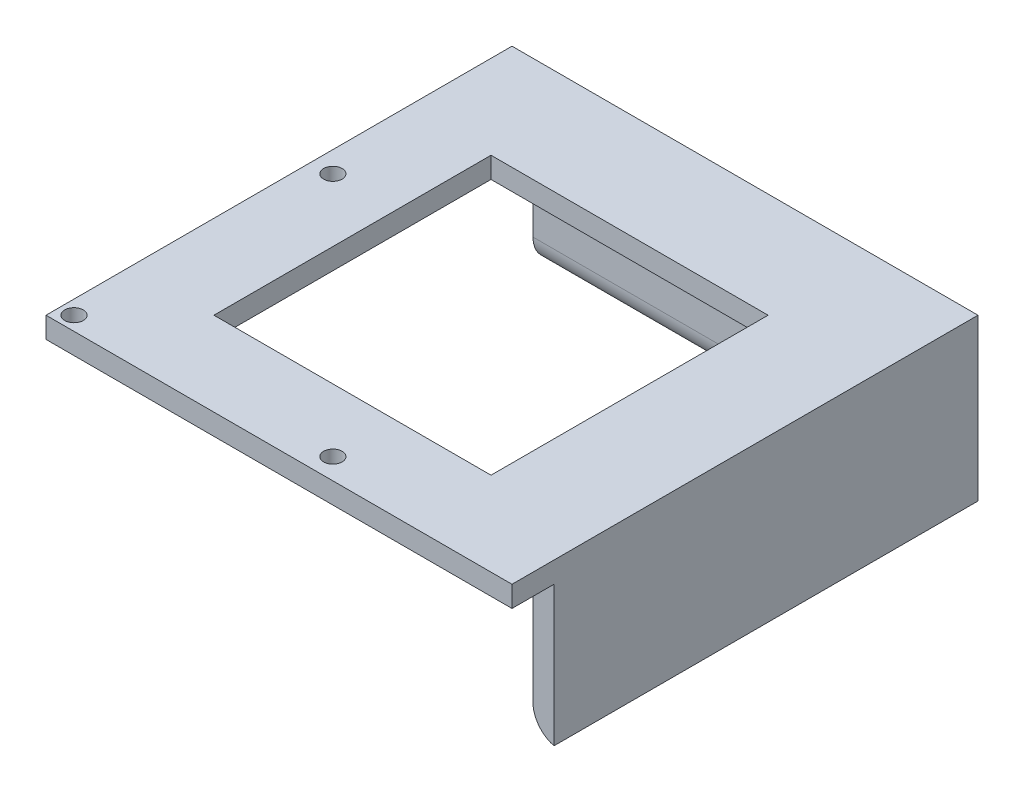
ISO-10303-21;
HEADER;
FILE_DESCRIPTION(('STEP AP214'),'2;1');
FILE_NAME('part.step','',(''),(''),'','','');
FILE_SCHEMA(('AUTOMOTIVE_DESIGN { 1 0 10303 214 1 1 1 1 }'));
ENDSEC;
DATA;
#1=APPLICATION_CONTEXT('core data for automotive mechanical design processes');
#2=APPLICATION_PROTOCOL_DEFINITION('international standard','automotive_design',2000,#1);
#3=PRODUCT_CONTEXT('',#1,'mechanical');
#4=PRODUCT('Part','Part','',(#3));
#5=PRODUCT_RELATED_PRODUCT_CATEGORY('part','',(#4));
#6=PRODUCT_DEFINITION_FORMATION('','',#4);
#7=PRODUCT_DEFINITION_CONTEXT('part definition',#1,'design');
#8=PRODUCT_DEFINITION('design','',#6,#7);
#9=PRODUCT_DEFINITION_SHAPE('','',#8);
#10=(LENGTH_UNIT() NAMED_UNIT(*) SI_UNIT(.MILLI.,.METRE.));
#11=(NAMED_UNIT(*) PLANE_ANGLE_UNIT() SI_UNIT($,.RADIAN.));
#12=(NAMED_UNIT(*) SI_UNIT($,.STERADIAN.) SOLID_ANGLE_UNIT());
#13=UNCERTAINTY_MEASURE_WITH_UNIT(LENGTH_MEASURE(1.E-05),#10,'distance_accuracy_value','');
#14=(GEOMETRIC_REPRESENTATION_CONTEXT(3) GLOBAL_UNCERTAINTY_ASSIGNED_CONTEXT((#13)) GLOBAL_UNIT_ASSIGNED_CONTEXT((#10,
#11,#12)) REPRESENTATION_CONTEXT('',''));
#15=CARTESIAN_POINT('',(0.,0.,0.));
#16=DIRECTION('',(0.,0.,1.));
#17=DIRECTION('',(1.,0.,0.));
#18=AXIS2_PLACEMENT_3D('',#15,#16,#17);
#19=CARTESIAN_POINT('',(0.,0.,0.));
#20=DIRECTION('',(0.,-1.,0.));
#21=DIRECTION('',(0.,0.,-1.));
#22=AXIS2_PLACEMENT_3D('',#19,#20,#21);
#23=PLANE('',#22);
#24=DIRECTION('',(0.,0.,-1.));
#25=VECTOR('',#24,1.);
#26=CARTESIAN_POINT('',(19.05,0.,-19.05));
#27=LINE('',#26,#25);
#28=CARTESIAN_POINT('',(19.05,0.,-19.05));
#29=VERTEX_POINT('',#28);
#30=CARTESIAN_POINT('',(19.05,0.,-81.915));
#31=VERTEX_POINT('',#30);
#32=EDGE_CURVE('E53',#29,#31,#27,.T.);
#33=ORIENTED_EDGE('',*,*,#32,.F.);
#34=DIRECTION('',(-1.,0.,0.));
#35=VECTOR('',#34,1.);
#36=CARTESIAN_POINT('',(81.915,0.,-19.05));
#37=LINE('',#36,#35);
#38=CARTESIAN_POINT('',(81.915,0.,-19.05));
#39=VERTEX_POINT('',#38);
#40=EDGE_CURVE('E150',#39,#29,#37,.T.);
#41=ORIENTED_EDGE('',*,*,#40,.F.);
#42=DIRECTION('',(0.,0.,1.));
#43=VECTOR('',#42,1.);
#44=CARTESIAN_POINT('',(81.915,0.,-81.915));
#45=LINE('',#44,#43);
#46=CARTESIAN_POINT('',(81.915,0.,-81.915));
#47=VERTEX_POINT('',#46);
#48=EDGE_CURVE('E153',#47,#39,#45,.T.);
#49=ORIENTED_EDGE('',*,*,#48,.F.);
#50=DIRECTION('',(1.,0.,0.));
#51=VECTOR('',#50,1.);
#52=CARTESIAN_POINT('',(19.05,0.,-81.915));
#53=LINE('',#52,#51);
#54=EDGE_CURVE('E159',#31,#47,#53,.T.);
#55=ORIENTED_EDGE('',*,*,#54,.F.);
#56=EDGE_LOOP('',(#33,#41,#49,#55));
#57=FACE_BOUND('',#56,.T.);
#58=CARTESIAN_POINT('',(4.7625,0.,-60.325));
#59=DIRECTION('',(0.,-1.,0.));
#60=DIRECTION('',(0.,0.,-1.));
#61=AXIS2_PLACEMENT_3D('',#58,#59,#60);
#62=CIRCLE('',#61,2.099999991);
#63=CARTESIAN_POINT('',(4.7625,0.,-62.424999991));
#64=VERTEX_POINT('',#63);
#65=EDGE_CURVE('E183',#64,#64,#62,.T.);
#66=ORIENTED_EDGE('',*,*,#65,.F.);
#67=EDGE_LOOP('',(#66));
#68=FACE_BOUND('',#67,.T.);
#69=CARTESIAN_POINT('',(60.325,0.,-4.7625));
#70=DIRECTION('',(0.,-1.,0.));
#71=DIRECTION('',(0.,0.,-1.));
#72=AXIS2_PLACEMENT_3D('',#69,#70,#71);
#73=CIRCLE('',#72,2.099999991);
#74=CARTESIAN_POINT('',(60.325,0.,-6.862499991));
#75=VERTEX_POINT('',#74);
#76=EDGE_CURVE('E180',#75,#75,#73,.T.);
#77=ORIENTED_EDGE('',*,*,#76,.F.);
#78=EDGE_LOOP('',(#77));
#79=FACE_BOUND('',#78,.T.);
#80=CARTESIAN_POINT('',(3.175,0.,-3.175));
#81=DIRECTION('',(0.,-1.,0.));
#82=DIRECTION('',(0.,0.,-1.));
#83=AXIS2_PLACEMENT_3D('',#80,#81,#82);
#84=CIRCLE('',#83,2.099999991);
#85=CARTESIAN_POINT('',(3.175,0.,-5.274999991));
#86=VERTEX_POINT('',#85);
#87=EDGE_CURVE('E177',#86,#86,#84,.T.);
#88=ORIENTED_EDGE('',*,*,#87,.F.);
#89=EDGE_LOOP('',(#88));
#90=FACE_BOUND('',#89,.T.);
#91=DIRECTION('',(-1.,0.,0.));
#92=VECTOR('',#91,1.);
#93=CARTESIAN_POINT('',(0.,0.,-105.7275));
#94=LINE('',#93,#92);
#95=CARTESIAN_POINT('',(9.52499999999998,0.,-105.7275));
#96=VERTEX_POINT('',#95);
#97=CARTESIAN_POINT('',(0.,0.,-105.7275));
#98=VERTEX_POINT('',#97);
#99=EDGE_CURVE('E219',#96,#98,#94,.T.);
#100=ORIENTED_EDGE('',*,*,#99,.F.);
#101=DIRECTION('',(0.,0.,1.));
#102=VECTOR('',#101,1.);
#103=CARTESIAN_POINT('',(9.525,0.,-100.965));
#104=LINE('',#103,#102);
#105=CARTESIAN_POINT('',(9.525,0.,-100.965));
#106=VERTEX_POINT('',#105);
#107=EDGE_CURVE('E186',#96,#106,#104,.T.);
#108=ORIENTED_EDGE('',*,*,#107,.T.);
#109=DIRECTION('',(1.,0.,0.));
#110=VECTOR('',#109,1.);
#111=CARTESIAN_POINT('',(9.525,0.,-100.965));
#112=LINE('',#111,#110);
#113=CARTESIAN_POINT('',(100.965,0.,-100.965));
#114=VERTEX_POINT('',#113);
#115=EDGE_CURVE('E197',#106,#114,#112,.T.);
#116=ORIENTED_EDGE('',*,*,#115,.T.);
#117=DIRECTION('',(0.,0.,1.));
#118=VECTOR('',#117,1.);
#119=CARTESIAN_POINT('',(100.965,0.,-9.52500000000001));
#120=LINE('',#119,#118);
#121=CARTESIAN_POINT('',(100.965,0.,-9.52500000000001));
#122=VERTEX_POINT('',#121);
#123=EDGE_CURVE('E200',#114,#122,#120,.T.);
#124=ORIENTED_EDGE('',*,*,#123,.T.);
#125=DIRECTION('',(1.,0.,0.));
#126=VECTOR('',#125,1.);
#127=CARTESIAN_POINT('',(100.965,0.,-9.52500000000001));
#128=LINE('',#127,#126);
#129=CARTESIAN_POINT('',(105.7275,0.,-9.52500000000001));
#130=VERTEX_POINT('',#129);
#131=EDGE_CURVE('E191',#122,#130,#128,.T.);
#132=ORIENTED_EDGE('',*,*,#131,.T.);
#133=DIRECTION('',(0.,0.,-1.));
#134=VECTOR('',#133,1.);
#135=CARTESIAN_POINT('',(105.7275,0.,0.));
#136=LINE('',#135,#134);
#137=CARTESIAN_POINT('',(105.7275,0.,0.));
#138=VERTEX_POINT('',#137);
#139=EDGE_CURVE('E230',#138,#130,#136,.T.);
#140=ORIENTED_EDGE('',*,*,#139,.F.);
#141=DIRECTION('',(1.,0.,0.));
#142=VECTOR('',#141,1.);
#143=CARTESIAN_POINT('',(0.,0.,0.));
#144=LINE('',#143,#142);
#145=CARTESIAN_POINT('',(0.,0.,0.));
#146=VERTEX_POINT('',#145);
#147=EDGE_CURVE('E228',#146,#138,#144,.T.);
#148=ORIENTED_EDGE('',*,*,#147,.F.);
#149=DIRECTION('',(0.,0.,1.));
#150=VECTOR('',#149,1.);
#151=CARTESIAN_POINT('',(0.,0.,0.));
#152=LINE('',#151,#150);
#153=EDGE_CURVE('E207',#98,#146,#152,.T.);
#154=ORIENTED_EDGE('',*,*,#153,.F.);
#155=EDGE_LOOP('',(#100,#108,#116,#124,#132,#140,#148,#154));
#156=FACE_BOUND('',#155,.T.);
#157=ADVANCED_FACE('F37',(#57,#68,#79,#90,#156),#23,.T.);
#158=CARTESIAN_POINT('',(0.,4.7625,0.));
#159=DIRECTION('',(1.,0.,0.));
#160=DIRECTION('',(0.,0.,-1.));
#161=AXIS2_PLACEMENT_3D('',#158,#159,#160);
#162=PLANE('',#161);
#163=ORIENTED_EDGE('',*,*,#153,.T.);
#164=DIRECTION('',(0.,-1.,0.));
#165=VECTOR('',#164,1.);
#166=CARTESIAN_POINT('',(0.,4.7625,0.));
#167=LINE('',#166,#165);
#168=CARTESIAN_POINT('',(0.,4.7625,0.));
#169=VERTEX_POINT('',#168);
#170=EDGE_CURVE('E241',#169,#146,#167,.T.);
#171=ORIENTED_EDGE('',*,*,#170,.F.);
#172=DIRECTION('',(0.,0.,1.));
#173=VECTOR('',#172,1.);
#174=CARTESIAN_POINT('',(0.,4.7625,0.));
#175=LINE('',#174,#173);
#176=CARTESIAN_POINT('',(0.,4.7625,-105.7275));
#177=VERTEX_POINT('',#176);
#178=EDGE_CURVE('E215',#177,#169,#175,.T.);
#179=ORIENTED_EDGE('',*,*,#178,.F.);
#180=DIRECTION('',(0.,-1.,0.));
#181=VECTOR('',#180,1.);
#182=CARTESIAN_POINT('',(0.,4.7625,-105.7275));
#183=LINE('',#182,#181);
#184=EDGE_CURVE('E225',#177,#98,#183,.T.);
#185=ORIENTED_EDGE('',*,*,#184,.T.);
#186=EDGE_LOOP('',(#163,#171,#179,#185));
#187=FACE_BOUND('',#186,.T.);
#188=ADVANCED_FACE('F293',(#187),#162,.F.);
#189=CARTESIAN_POINT('',(0.,4.7625,0.));
#190=DIRECTION('',(0.,0.,-1.));
#191=DIRECTION('',(-1.,0.,0.));
#192=AXIS2_PLACEMENT_3D('',#189,#190,#191);
#193=PLANE('',#192);
#194=ORIENTED_EDGE('',*,*,#147,.T.);
#195=DIRECTION('',(0.,-1.,0.));
#196=VECTOR('',#195,1.);
#197=CARTESIAN_POINT('',(105.7275,4.7625,0.));
#198=LINE('',#197,#196);
#199=CARTESIAN_POINT('',(105.7275,4.7625,0.));
#200=VERTEX_POINT('',#199);
#201=EDGE_CURVE('E238',#200,#138,#198,.T.);
#202=ORIENTED_EDGE('',*,*,#201,.F.);
#203=DIRECTION('',(1.,0.,0.));
#204=VECTOR('',#203,1.);
#205=CARTESIAN_POINT('',(0.,4.7625,0.));
#206=LINE('',#205,#204);
#207=EDGE_CURVE('E218',#169,#200,#206,.T.);
#208=ORIENTED_EDGE('',*,*,#207,.F.);
#209=ORIENTED_EDGE('',*,*,#170,.T.);
#210=EDGE_LOOP('',(#194,#202,#208,#209));
#211=FACE_BOUND('',#210,.T.);
#212=ADVANCED_FACE('F294',(#211),#193,.F.);
#213=CARTESIAN_POINT('',(105.7275,4.7625,0.));
#214=DIRECTION('',(-1.,0.,0.));
#215=DIRECTION('',(0.,0.,1.));
#216=AXIS2_PLACEMENT_3D('',#213,#214,#215);
#217=PLANE('',#216);
#218=ORIENTED_EDGE('',*,*,#139,.T.);
#219=DIRECTION('',(0.,1.,0.));
#220=VECTOR('',#219,1.);
#221=CARTESIAN_POINT('',(105.7275,-31.75,-9.52500000000001));
#222=LINE('',#221,#220);
#223=CARTESIAN_POINT('',(105.7275,-31.75,-9.52500000000001));
#224=VERTEX_POINT('',#223);
#225=EDGE_CURVE('E205',#224,#130,#222,.T.);
#226=ORIENTED_EDGE('',*,*,#225,.F.);
#227=DIRECTION('',(0.,0.,-1.));
#228=VECTOR('',#227,1.);
#229=CARTESIAN_POINT('',(105.7275,-31.75,-9.52500000000001));
#230=LINE('',#229,#228);
#231=CARTESIAN_POINT('',(105.7275,-31.75,-105.7275));
#232=VERTEX_POINT('',#231);
#233=EDGE_CURVE('E190',#224,#232,#230,.T.);
#234=ORIENTED_EDGE('',*,*,#233,.T.);
#235=DIRECTION('',(0.,-1.,0.));
#236=VECTOR('',#235,1.);
#237=CARTESIAN_POINT('',(105.7275,4.7625,-105.7275));
#238=LINE('',#237,#236);
#239=CARTESIAN_POINT('',(105.7275,4.7625,-105.7275));
#240=VERTEX_POINT('',#239);
#241=EDGE_CURVE('E236',#240,#232,#238,.T.);
#242=ORIENTED_EDGE('',*,*,#241,.F.);
#243=DIRECTION('',(0.,0.,-1.));
#244=VECTOR('',#243,1.);
#245=CARTESIAN_POINT('',(105.7275,4.7625,0.));
#246=LINE('',#245,#244);
#247=EDGE_CURVE('E221',#200,#240,#246,.T.);
#248=ORIENTED_EDGE('',*,*,#247,.F.);
#249=ORIENTED_EDGE('',*,*,#201,.T.);
#250=EDGE_LOOP('',(#218,#226,#234,#242,#248,#249));
#251=FACE_BOUND('',#250,.T.);
#252=ADVANCED_FACE('F266',(#251),#217,.F.);
#253=CARTESIAN_POINT('',(0.,4.7625,-105.7275));
#254=DIRECTION('',(0.,0.,1.));
#255=DIRECTION('',(1.,0.,0.));
#256=AXIS2_PLACEMENT_3D('',#253,#254,#255);
#257=PLANE('',#256);
#258=ORIENTED_EDGE('',*,*,#241,.T.);
#259=DIRECTION('',(-1.,0.,0.));
#260=VECTOR('',#259,1.);
#261=CARTESIAN_POINT('',(9.52499999999998,-31.75,-105.7275));
#262=LINE('',#261,#260);
#263=CARTESIAN_POINT('',(9.52499999999998,-31.75,-105.7275));
#264=VERTEX_POINT('',#263);
#265=EDGE_CURVE('E187',#232,#264,#262,.T.);
#266=ORIENTED_EDGE('',*,*,#265,.T.);
#267=DIRECTION('',(0.,1.,0.));
#268=VECTOR('',#267,1.);
#269=CARTESIAN_POINT('',(9.52499999999998,-31.75,-105.7275));
#270=LINE('',#269,#268);
#271=EDGE_CURVE('E194',#264,#96,#270,.T.);
#272=ORIENTED_EDGE('',*,*,#271,.T.);
#273=ORIENTED_EDGE('',*,*,#99,.T.);
#274=ORIENTED_EDGE('',*,*,#184,.F.);
#275=DIRECTION('',(-1.,0.,0.));
#276=VECTOR('',#275,1.);
#277=CARTESIAN_POINT('',(0.,4.7625,-105.7275));
#278=LINE('',#277,#276);
#279=EDGE_CURVE('E223',#240,#177,#278,.T.);
#280=ORIENTED_EDGE('',*,*,#279,.F.);
#281=EDGE_LOOP('',(#258,#266,#272,#273,#274,#280));
#282=FACE_BOUND('',#281,.T.);
#283=ADVANCED_FACE('F274',(#282),#257,.F.);
#284=CARTESIAN_POINT('',(0.,4.7625,0.));
#285=DIRECTION('',(0.,-1.,0.));
#286=DIRECTION('',(0.,0.,-1.));
#287=AXIS2_PLACEMENT_3D('',#284,#285,#286);
#288=PLANE('',#287);
#289=DIRECTION('',(-1.,0.,0.));
#290=VECTOR('',#289,1.);
#291=CARTESIAN_POINT('',(81.915,4.7625,-19.05));
#292=LINE('',#291,#290);
#293=CARTESIAN_POINT('',(81.915,4.7625,-19.05));
#294=VERTEX_POINT('',#293);
#295=CARTESIAN_POINT('',(19.05,4.7625,-19.05));
#296=VERTEX_POINT('',#295);
#297=EDGE_CURVE('E140',#294,#296,#292,.T.);
#298=ORIENTED_EDGE('',*,*,#297,.T.);
#299=DIRECTION('',(0.,0.,-1.));
#300=VECTOR('',#299,1.);
#301=CARTESIAN_POINT('',(19.05,4.7625,-19.05));
#302=LINE('',#301,#300);
#303=CARTESIAN_POINT('',(19.05,4.7625,-81.915));
#304=VERTEX_POINT('',#303);
#305=EDGE_CURVE('E134',#296,#304,#302,.T.);
#306=ORIENTED_EDGE('',*,*,#305,.T.);
#307=DIRECTION('',(1.,0.,0.));
#308=VECTOR('',#307,1.);
#309=CARTESIAN_POINT('',(19.05,4.7625,-81.915));
#310=LINE('',#309,#308);
#311=CARTESIAN_POINT('',(81.915,4.7625,-81.915));
#312=VERTEX_POINT('',#311);
#313=EDGE_CURVE('E143',#304,#312,#310,.T.);
#314=ORIENTED_EDGE('',*,*,#313,.T.);
#315=DIRECTION('',(0.,0.,1.));
#316=VECTOR('',#315,1.);
#317=CARTESIAN_POINT('',(81.915,4.7625,-81.915));
#318=LINE('',#317,#316);
#319=EDGE_CURVE('E61',#312,#294,#318,.T.);
#320=ORIENTED_EDGE('',*,*,#319,.T.);
#321=EDGE_LOOP('',(#298,#306,#314,#320));
#322=FACE_BOUND('',#321,.T.);
#323=CARTESIAN_POINT('',(4.7625,4.7625,-60.325));
#324=DIRECTION('',(0.,1.,0.));
#325=DIRECTION('',(0.,0.,1.));
#326=AXIS2_PLACEMENT_3D('',#323,#324,#325);
#327=CIRCLE('',#326,2.099999991);
#328=CARTESIAN_POINT('',(4.7625,4.7625,-58.225000009));
#329=VERTEX_POINT('',#328);
#330=EDGE_CURVE('E172',#329,#329,#327,.T.);
#331=ORIENTED_EDGE('',*,*,#330,.F.);
#332=EDGE_LOOP('',(#331));
#333=FACE_BOUND('',#332,.T.);
#334=CARTESIAN_POINT('',(60.325,4.7625,-4.7625));
#335=DIRECTION('',(0.,1.,0.));
#336=DIRECTION('',(0.,0.,1.));
#337=AXIS2_PLACEMENT_3D('',#334,#335,#336);
#338=CIRCLE('',#337,2.099999991);
#339=CARTESIAN_POINT('',(60.325,4.7625,-2.662500009));
#340=VERTEX_POINT('',#339);
#341=EDGE_CURVE('E168',#340,#340,#338,.T.);
#342=ORIENTED_EDGE('',*,*,#341,.F.);
#343=EDGE_LOOP('',(#342));
#344=FACE_BOUND('',#343,.T.);
#345=CARTESIAN_POINT('',(3.175,4.7625,-3.175));
#346=DIRECTION('',(0.,1.,0.));
#347=DIRECTION('',(0.,0.,1.));
#348=AXIS2_PLACEMENT_3D('',#345,#346,#347);
#349=CIRCLE('',#348,2.099999991);
#350=CARTESIAN_POINT('',(3.175,4.7625,-1.075000009));
#351=VERTEX_POINT('',#350);
#352=EDGE_CURVE('E171',#351,#351,#349,.T.);
#353=ORIENTED_EDGE('',*,*,#352,.F.);
#354=EDGE_LOOP('',(#353));
#355=FACE_BOUND('',#354,.T.);
#356=ORIENTED_EDGE('',*,*,#178,.T.);
#357=ORIENTED_EDGE('',*,*,#207,.T.);
#358=ORIENTED_EDGE('',*,*,#247,.T.);
#359=ORIENTED_EDGE('',*,*,#279,.T.);
#360=EDGE_LOOP('',(#356,#357,#358,#359));
#361=FACE_BOUND('',#360,.T.);
#362=ADVANCED_FACE('F147',(#322,#333,#344,#355,#361),#288,.F.);
#363=CARTESIAN_POINT('',(100.965,-31.75,-9.52500000000001));
#364=DIRECTION('',(0.,0.,1.));
#365=DIRECTION('',(1.,0.,0.));
#366=AXIS2_PLACEMENT_3D('',#363,#364,#365);
#367=PLANE('',#366);
#368=DIRECTION('',(0.,1.,0.));
#369=VECTOR('',#368,1.);
#370=CARTESIAN_POINT('',(100.965,-31.75,-9.52500000000001));
#371=LINE('',#370,#369);
#372=CARTESIAN_POINT('',(100.965,-25.6016389378957,-9.52500000000001));
#373=VERTEX_POINT('',#372);
#374=EDGE_CURVE('E208',#373,#122,#371,.T.);
#375=ORIENTED_EDGE('',*,*,#374,.F.);
#376=CARTESIAN_POINT('',(107.315,-25.6016389378957,-9.52500000000001));
#377=DIRECTION('',(0.,0.,1.));
#378=DIRECTION('',(1.,0.,0.));
#379=AXIS2_PLACEMENT_3D('',#376,#377,#378);
#380=CIRCLE('',#379,6.35);
#381=EDGE_CURVE('E11',#373,#224,#380,.T.);
#382=ORIENTED_EDGE('',*,*,#381,.T.);
#383=ORIENTED_EDGE('',*,*,#225,.T.);
#384=ORIENTED_EDGE('',*,*,#131,.F.);
#385=EDGE_LOOP('',(#375,#382,#383,#384));
#386=FACE_BOUND('',#385,.T.);
#387=ADVANCED_FACE('F260',(#386),#367,.T.);
#388=CARTESIAN_POINT('',(100.965,-31.75,-9.52500000000001));
#389=DIRECTION('',(-1.,0.,0.));
#390=DIRECTION('',(0.,0.,1.));
#391=AXIS2_PLACEMENT_3D('',#388,#389,#390);
#392=PLANE('',#391);
#393=DIRECTION('',(0.,1.,0.));
#394=VECTOR('',#393,1.);
#395=CARTESIAN_POINT('',(100.965,-31.75,-100.965));
#396=LINE('',#395,#394);
#397=CARTESIAN_POINT('',(100.965,-25.6016389378957,-100.965));
#398=VERTEX_POINT('',#397);
#399=EDGE_CURVE('E210',#398,#114,#396,.T.);
#400=ORIENTED_EDGE('',*,*,#399,.F.);
#401=DIRECTION('',(0.,0.,-1.));
#402=VECTOR('',#401,1.);
#403=CARTESIAN_POINT('',(100.965,-25.6016389378957,-9.52500000000001));
#404=LINE('',#403,#402);
#405=EDGE_CURVE('E46',#398,#373,#404,.F.);
#406=ORIENTED_EDGE('',*,*,#405,.T.);
#407=ORIENTED_EDGE('',*,*,#374,.T.);
#408=ORIENTED_EDGE('',*,*,#123,.F.);
#409=EDGE_LOOP('',(#400,#406,#407,#408));
#410=FACE_BOUND('',#409,.T.);
#411=ADVANCED_FACE('F253',(#410),#392,.T.);
#412=CARTESIAN_POINT('',(9.525,-31.75,-100.965));
#413=DIRECTION('',(0.,0.,1.));
#414=DIRECTION('',(1.,0.,0.));
#415=AXIS2_PLACEMENT_3D('',#412,#413,#414);
#416=PLANE('',#415);
#417=DIRECTION('',(0.,1.,0.));
#418=VECTOR('',#417,1.);
#419=CARTESIAN_POINT('',(9.525,-31.75,-100.965));
#420=LINE('',#419,#418);
#421=CARTESIAN_POINT('',(9.525,-25.6016389378957,-100.965));
#422=VERTEX_POINT('',#421);
#423=EDGE_CURVE('E212',#422,#106,#420,.T.);
#424=ORIENTED_EDGE('',*,*,#423,.F.);
#425=DIRECTION('',(-1.,0.,0.));
#426=VECTOR('',#425,1.);
#427=CARTESIAN_POINT('',(100.965,-25.6016389378957,-100.965));
#428=LINE('',#427,#426);
#429=EDGE_CURVE('E244',#422,#398,#428,.F.);
#430=ORIENTED_EDGE('',*,*,#429,.T.);
#431=ORIENTED_EDGE('',*,*,#399,.T.);
#432=ORIENTED_EDGE('',*,*,#115,.F.);
#433=EDGE_LOOP('',(#424,#430,#431,#432));
#434=FACE_BOUND('',#433,.T.);
#435=ADVANCED_FACE('F289',(#434),#416,.T.);
#436=CARTESIAN_POINT('',(9.525,-31.75,-100.965));
#437=DIRECTION('',(-1.,0.,0.));
#438=DIRECTION('',(0.,0.,1.));
#439=AXIS2_PLACEMENT_3D('',#436,#437,#438);
#440=PLANE('',#439);
#441=ORIENTED_EDGE('',*,*,#271,.F.);
#442=CARTESIAN_POINT('',(9.52499999999998,-25.6016389378957,-107.315));
#443=DIRECTION('',(-1.,0.,0.));
#444=DIRECTION('',(0.,0.,1.));
#445=AXIS2_PLACEMENT_3D('',#442,#443,#444);
#446=CIRCLE('',#445,6.35);
#447=EDGE_CURVE('E247',#264,#422,#446,.T.);
#448=ORIENTED_EDGE('',*,*,#447,.T.);
#449=ORIENTED_EDGE('',*,*,#423,.T.);
#450=ORIENTED_EDGE('',*,*,#107,.F.);
#451=EDGE_LOOP('',(#441,#448,#449,#450));
#452=FACE_BOUND('',#451,.T.);
#453=ADVANCED_FACE('F291',(#452),#440,.T.);
#454=CARTESIAN_POINT('',(3.175,-31.75,-3.175));
#455=DIRECTION('',(0.,1.,0.));
#456=DIRECTION('',(0.,0.,1.));
#457=AXIS2_PLACEMENT_3D('',#454,#455,#456);
#458=CYLINDRICAL_SURFACE('',#457,2.099999991);
#459=ORIENTED_EDGE('',*,*,#87,.T.);
#460=EDGE_LOOP('',(#459));
#461=FACE_BOUND('',#460,.T.);
#462=ORIENTED_EDGE('',*,*,#352,.T.);
#463=EDGE_LOOP('',(#462));
#464=FACE_BOUND('',#463,.T.);
#465=ADVANCED_FACE('F327',(#461,#464),#458,.F.);
#466=CARTESIAN_POINT('',(60.325,-31.75,-4.7625));
#467=DIRECTION('',(0.,1.,0.));
#468=DIRECTION('',(0.,0.,1.));
#469=AXIS2_PLACEMENT_3D('',#466,#467,#468);
#470=CYLINDRICAL_SURFACE('',#469,2.099999991);
#471=ORIENTED_EDGE('',*,*,#76,.T.);
#472=EDGE_LOOP('',(#471));
#473=FACE_BOUND('',#472,.T.);
#474=ORIENTED_EDGE('',*,*,#341,.T.);
#475=EDGE_LOOP('',(#474));
#476=FACE_BOUND('',#475,.T.);
#477=ADVANCED_FACE('F335',(#473,#476),#470,.F.);
#478=CARTESIAN_POINT('',(4.7625,-31.75,-60.325));
#479=DIRECTION('',(0.,1.,0.));
#480=DIRECTION('',(0.,0.,1.));
#481=AXIS2_PLACEMENT_3D('',#478,#479,#480);
#482=CYLINDRICAL_SURFACE('',#481,2.099999991);
#483=ORIENTED_EDGE('',*,*,#65,.T.);
#484=EDGE_LOOP('',(#483));
#485=FACE_BOUND('',#484,.T.);
#486=ORIENTED_EDGE('',*,*,#330,.T.);
#487=EDGE_LOOP('',(#486));
#488=FACE_BOUND('',#487,.T.);
#489=ADVANCED_FACE('F340',(#485,#488),#482,.F.);
#490=CARTESIAN_POINT('',(107.315,-25.6016389378957,0.));
#491=DIRECTION('',(0.,0.,1.));
#492=DIRECTION('',(1.,0.,0.));
#493=AXIS2_PLACEMENT_3D('',#490,#491,#492);
#494=CYLINDRICAL_SURFACE('',#493,6.35);
#495=ORIENTED_EDGE('',*,*,#381,.F.);
#496=ORIENTED_EDGE('',*,*,#405,.F.);
#497=CARTESIAN_POINT('',(107.315,-25.6016389378957,-107.315));
#498=DIRECTION('',(0.707106781186547,0.,0.707106781186547));
#499=DIRECTION('',(-0.707106781186547,0.,0.707106781186547));
#500=AXIS2_PLACEMENT_3D('',#497,#498,#499);
#501=ELLIPSE('',#500,8.98025612106915,6.35);
#502=EDGE_CURVE('E41',#232,#398,#501,.F.);
#503=ORIENTED_EDGE('',*,*,#502,.F.);
#504=ORIENTED_EDGE('',*,*,#233,.F.);
#505=EDGE_LOOP('',(#495,#496,#503,#504));
#506=FACE_BOUND('',#505,.T.);
#507=ADVANCED_FACE('F39',(#506),#494,.T.);
#508=CARTESIAN_POINT('',(0.,-25.6016389378957,-107.315));
#509=DIRECTION('',(1.,0.,0.));
#510=DIRECTION('',(0.,0.,-1.));
#511=AXIS2_PLACEMENT_3D('',#508,#509,#510);
#512=CYLINDRICAL_SURFACE('',#511,6.35);
#513=ORIENTED_EDGE('',*,*,#447,.F.);
#514=ORIENTED_EDGE('',*,*,#265,.F.);
#515=ORIENTED_EDGE('',*,*,#502,.T.);
#516=ORIENTED_EDGE('',*,*,#429,.F.);
#517=EDGE_LOOP('',(#513,#514,#515,#516));
#518=FACE_BOUND('',#517,.T.);
#519=ADVANCED_FACE('F271',(#518),#512,.T.);
#520=CARTESIAN_POINT('',(19.05,4.7625,-19.05));
#521=DIRECTION('',(-1.,0.,0.));
#522=DIRECTION('',(0.,0.,1.));
#523=AXIS2_PLACEMENT_3D('',#520,#521,#522);
#524=PLANE('',#523);
#525=ORIENTED_EDGE('',*,*,#32,.T.);
#526=DIRECTION('',(0.,-1.,0.));
#527=VECTOR('',#526,1.);
#528=CARTESIAN_POINT('',(19.05,4.7625,-81.915));
#529=LINE('',#528,#527);
#530=EDGE_CURVE('E130',#304,#31,#529,.T.);
#531=ORIENTED_EDGE('',*,*,#530,.F.);
#532=ORIENTED_EDGE('',*,*,#305,.F.);
#533=DIRECTION('',(0.,-1.,0.));
#534=VECTOR('',#533,1.);
#535=CARTESIAN_POINT('',(19.05,4.7625,-19.05));
#536=LINE('',#535,#534);
#537=EDGE_CURVE('E163',#296,#29,#536,.T.);
#538=ORIENTED_EDGE('',*,*,#537,.T.);
#539=EDGE_LOOP('',(#525,#531,#532,#538));
#540=FACE_BOUND('',#539,.T.);
#541=ADVANCED_FACE('F132',(#540),#524,.F.);
#542=CARTESIAN_POINT('',(81.915,4.7625,-19.05));
#543=DIRECTION('',(0.,0.,1.));
#544=DIRECTION('',(1.,0.,0.));
#545=AXIS2_PLACEMENT_3D('',#542,#543,#544);
#546=PLANE('',#545);
#547=ORIENTED_EDGE('',*,*,#40,.T.);
#548=ORIENTED_EDGE('',*,*,#537,.F.);
#549=ORIENTED_EDGE('',*,*,#297,.F.);
#550=DIRECTION('',(0.,-1.,0.));
#551=VECTOR('',#550,1.);
#552=CARTESIAN_POINT('',(81.915,4.7625,-19.05));
#553=LINE('',#552,#551);
#554=EDGE_CURVE('E165',#294,#39,#553,.T.);
#555=ORIENTED_EDGE('',*,*,#554,.T.);
#556=EDGE_LOOP('',(#547,#548,#549,#555));
#557=FACE_BOUND('',#556,.T.);
#558=ADVANCED_FACE('F356',(#557),#546,.F.);
#559=CARTESIAN_POINT('',(81.915,4.7625,-81.915));
#560=DIRECTION('',(1.,0.,0.));
#561=DIRECTION('',(0.,0.,-1.));
#562=AXIS2_PLACEMENT_3D('',#559,#560,#561);
#563=PLANE('',#562);
#564=ORIENTED_EDGE('',*,*,#48,.T.);
#565=ORIENTED_EDGE('',*,*,#554,.F.);
#566=ORIENTED_EDGE('',*,*,#319,.F.);
#567=DIRECTION('',(0.,-1.,0.));
#568=VECTOR('',#567,1.);
#569=CARTESIAN_POINT('',(81.915,4.7625,-81.915));
#570=LINE('',#569,#568);
#571=EDGE_CURVE('E139',#312,#47,#570,.T.);
#572=ORIENTED_EDGE('',*,*,#571,.T.);
#573=EDGE_LOOP('',(#564,#565,#566,#572));
#574=FACE_BOUND('',#573,.T.);
#575=ADVANCED_FACE('F359',(#574),#563,.F.);
#576=CARTESIAN_POINT('',(19.05,4.7625,-81.915));
#577=DIRECTION('',(0.,0.,-1.));
#578=DIRECTION('',(-1.,0.,0.));
#579=AXIS2_PLACEMENT_3D('',#576,#577,#578);
#580=PLANE('',#579);
#581=ORIENTED_EDGE('',*,*,#54,.T.);
#582=ORIENTED_EDGE('',*,*,#571,.F.);
#583=ORIENTED_EDGE('',*,*,#313,.F.);
#584=ORIENTED_EDGE('',*,*,#530,.T.);
#585=EDGE_LOOP('',(#581,#582,#583,#584));
#586=FACE_BOUND('',#585,.T.);
#587=ADVANCED_FACE('F144',(#586),#580,.F.);
#588=CLOSED_SHELL('',(#157,#188,#212,#252,#283,#362,#387,#411,#435,#453,#465,#477,#489,#507,
#519,#541,#558,#575,#587));
#589=MANIFOLD_SOLID_BREP('B2',#588);
#590=ADVANCED_BREP_SHAPE_REPRESENTATION('',(#18,#589),#14);
#591=SHAPE_DEFINITION_REPRESENTATION(#9,#590);
ENDSEC;
END-ISO-10303-21;
